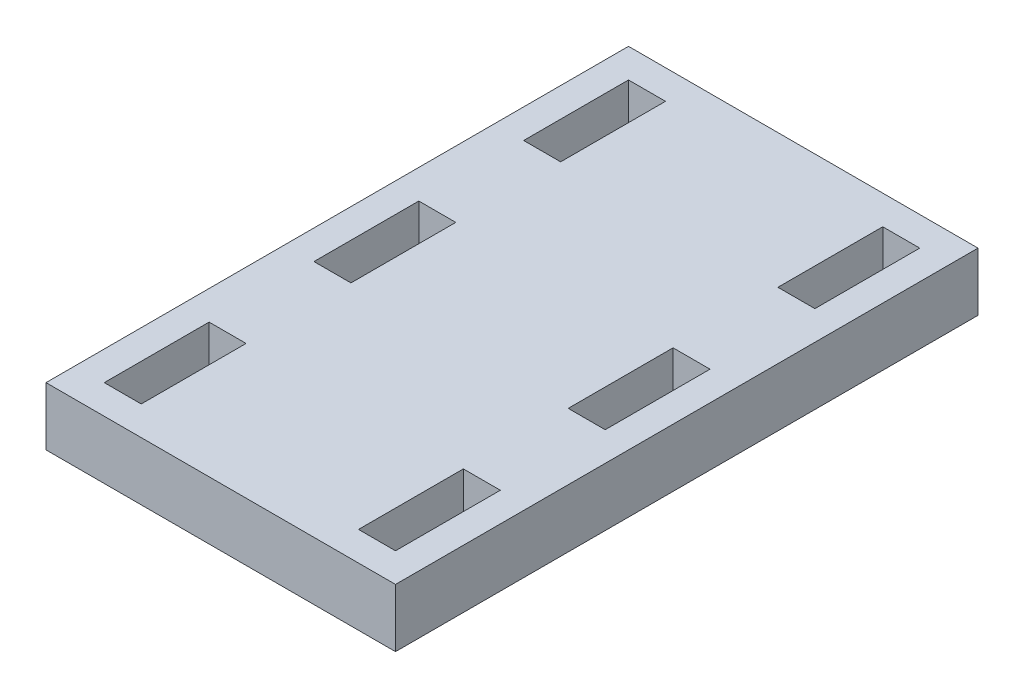
ISO-10303-21;
HEADER;
FILE_DESCRIPTION(('STEP AP214'),'2;1');
FILE_NAME('part.step','',(''),(''),'','','');
FILE_SCHEMA(('AUTOMOTIVE_DESIGN { 1 0 10303 214 1 1 1 1 }'));
ENDSEC;
DATA;
#1=APPLICATION_CONTEXT('core data for automotive mechanical design processes');
#2=APPLICATION_PROTOCOL_DEFINITION('international standard','automotive_design',2000,#1);
#3=PRODUCT_CONTEXT('',#1,'mechanical');
#4=PRODUCT('Part','Part','',(#3));
#5=PRODUCT_RELATED_PRODUCT_CATEGORY('part','',(#4));
#6=PRODUCT_DEFINITION_FORMATION('','',#4);
#7=PRODUCT_DEFINITION_CONTEXT('part definition',#1,'design');
#8=PRODUCT_DEFINITION('design','',#6,#7);
#9=PRODUCT_DEFINITION_SHAPE('','',#8);
#10=(LENGTH_UNIT() NAMED_UNIT(*) SI_UNIT(.MILLI.,.METRE.));
#11=(NAMED_UNIT(*) PLANE_ANGLE_UNIT() SI_UNIT($,.RADIAN.));
#12=(NAMED_UNIT(*) SI_UNIT($,.STERADIAN.) SOLID_ANGLE_UNIT());
#13=UNCERTAINTY_MEASURE_WITH_UNIT(LENGTH_MEASURE(1.E-05),#10,'distance_accuracy_value','');
#14=(GEOMETRIC_REPRESENTATION_CONTEXT(3) GLOBAL_UNCERTAINTY_ASSIGNED_CONTEXT((#13)) GLOBAL_UNIT_ASSIGNED_CONTEXT((#10,
#11,#12)) REPRESENTATION_CONTEXT('',''));
#15=CARTESIAN_POINT('',(0.,0.,0.));
#16=DIRECTION('',(0.,0.,1.));
#17=DIRECTION('',(1.,0.,0.));
#18=AXIS2_PLACEMENT_3D('',#15,#16,#17);
#19=CARTESIAN_POINT('',(0.,10.,0.));
#20=DIRECTION('',(0.,-1.,0.));
#21=DIRECTION('',(0.,0.,-1.));
#22=AXIS2_PLACEMENT_3D('',#19,#20,#21);
#23=PLANE('',#22);
#24=DIRECTION('',(0.,0.,-1.));
#25=VECTOR('',#24,1.);
#26=CARTESIAN_POINT('',(55.,10.,-41.));
#27=LINE('',#26,#25);
#28=CARTESIAN_POINT('',(55.,10.,-41.));
#29=VERTEX_POINT('',#28);
#30=CARTESIAN_POINT('',(55.,10.,-59.));
#31=VERTEX_POINT('',#30);
#32=EDGE_CURVE('E823',#29,#31,#27,.T.);
#33=ORIENTED_EDGE('',*,*,#32,.F.);
#34=DIRECTION('',(1.,0.,0.));
#35=VECTOR('',#34,1.);
#36=CARTESIAN_POINT('',(55.,10.,-41.));
#37=LINE('',#36,#35);
#38=CARTESIAN_POINT('',(48.65,10.,-41.));
#39=VERTEX_POINT('',#38);
#40=EDGE_CURVE('E838',#39,#29,#37,.T.);
#41=ORIENTED_EDGE('',*,*,#40,.F.);
#42=DIRECTION('',(0.,0.,1.));
#43=VECTOR('',#42,1.);
#44=CARTESIAN_POINT('',(48.65,10.,-41.));
#45=LINE('',#44,#43);
#46=CARTESIAN_POINT('',(48.65,10.,-59.));
#47=VERTEX_POINT('',#46);
#48=EDGE_CURVE('E886',#47,#39,#45,.T.);
#49=ORIENTED_EDGE('',*,*,#48,.F.);
#50=DIRECTION('',(-1.,0.,0.));
#51=VECTOR('',#50,1.);
#52=CARTESIAN_POINT('',(55.,10.,-59.));
#53=LINE('',#52,#51);
#54=EDGE_CURVE('E878',#31,#47,#53,.T.);
#55=ORIENTED_EDGE('',*,*,#54,.F.);
#56=EDGE_LOOP('',(#33,#41,#49,#55));
#57=FACE_BOUND('',#56,.T.);
#58=DIRECTION('',(0.,0.,1.));
#59=VECTOR('',#58,1.);
#60=CARTESIAN_POINT('',(5.,10.,-77.));
#61=LINE('',#60,#59);
#62=CARTESIAN_POINT('',(5.,10.,-95.));
#63=VERTEX_POINT('',#62);
#64=CARTESIAN_POINT('',(5.,10.,-77.));
#65=VERTEX_POINT('',#64);
#66=EDGE_CURVE('E479',#63,#65,#61,.T.);
#67=ORIENTED_EDGE('',*,*,#66,.F.);
#68=DIRECTION('',(-1.,0.,0.));
#69=VECTOR('',#68,1.);
#70=CARTESIAN_POINT('',(5.,10.,-95.));
#71=LINE('',#70,#69);
#72=CARTESIAN_POINT('',(11.35,10.,-95.));
#73=VERTEX_POINT('',#72);
#74=EDGE_CURVE('E492',#73,#63,#71,.T.);
#75=ORIENTED_EDGE('',*,*,#74,.F.);
#76=DIRECTION('',(0.,0.,-1.));
#77=VECTOR('',#76,1.);
#78=CARTESIAN_POINT('',(11.35,10.,-77.));
#79=LINE('',#78,#77);
#80=CARTESIAN_POINT('',(11.35,10.,-77.));
#81=VERTEX_POINT('',#80);
#82=EDGE_CURVE('E497',#81,#73,#79,.T.);
#83=ORIENTED_EDGE('',*,*,#82,.F.);
#84=DIRECTION('',(1.,0.,0.));
#85=VECTOR('',#84,1.);
#86=CARTESIAN_POINT('',(5.,10.,-77.));
#87=LINE('',#86,#85);
#88=EDGE_CURVE('E482',#65,#81,#87,.T.);
#89=ORIENTED_EDGE('',*,*,#88,.F.);
#90=EDGE_LOOP('',(#67,#75,#83,#89));
#91=FACE_BOUND('',#90,.T.);
#92=DIRECTION('',(0.,0.,1.));
#93=VECTOR('',#92,1.);
#94=CARTESIAN_POINT('',(5.,10.,-5.));
#95=LINE('',#94,#93);
#96=CARTESIAN_POINT('',(5.,10.,-23.));
#97=VERTEX_POINT('',#96);
#98=CARTESIAN_POINT('',(5.,10.,-5.));
#99=VERTEX_POINT('',#98);
#100=EDGE_CURVE('E339',#97,#99,#95,.T.);
#101=ORIENTED_EDGE('',*,*,#100,.F.);
#102=DIRECTION('',(-1.,0.,0.));
#103=VECTOR('',#102,1.);
#104=CARTESIAN_POINT('',(5.,10.,-23.));
#105=LINE('',#104,#103);
#106=CARTESIAN_POINT('',(11.35,10.,-23.));
#107=VERTEX_POINT('',#106);
#108=EDGE_CURVE('E355',#107,#97,#105,.T.);
#109=ORIENTED_EDGE('',*,*,#108,.F.);
#110=DIRECTION('',(0.,0.,-1.));
#111=VECTOR('',#110,1.);
#112=CARTESIAN_POINT('',(11.35,10.,-5.));
#113=LINE('',#112,#111);
#114=CARTESIAN_POINT('',(11.35,10.,-5.));
#115=VERTEX_POINT('',#114);
#116=EDGE_CURVE('E360',#115,#107,#113,.T.);
#117=ORIENTED_EDGE('',*,*,#116,.F.);
#118=DIRECTION('',(1.,0.,0.));
#119=VECTOR('',#118,1.);
#120=CARTESIAN_POINT('',(5.,10.,-5.));
#121=LINE('',#120,#119);
#122=EDGE_CURVE('E343',#99,#115,#121,.T.);
#123=ORIENTED_EDGE('',*,*,#122,.F.);
#124=EDGE_LOOP('',(#101,#109,#117,#123));
#125=FACE_BOUND('',#124,.T.);
#126=DIRECTION('',(0.,0.,1.));
#127=VECTOR('',#126,1.);
#128=CARTESIAN_POINT('',(0.,10.,0.));
#129=LINE('',#128,#127);
#130=CARTESIAN_POINT('',(0.,10.,-100.));
#131=VERTEX_POINT('',#130);
#132=CARTESIAN_POINT('',(0.,10.,0.));
#133=VERTEX_POINT('',#132);
#134=EDGE_CURVE('E390',#131,#133,#129,.T.);
#135=ORIENTED_EDGE('',*,*,#134,.T.);
#136=DIRECTION('',(1.,0.,0.));
#137=VECTOR('',#136,1.);
#138=CARTESIAN_POINT('',(0.,10.,0.));
#139=LINE('',#138,#137);
#140=CARTESIAN_POINT('',(60.,10.,0.));
#141=VERTEX_POINT('',#140);
#142=EDGE_CURVE('E395',#133,#141,#139,.T.);
#143=ORIENTED_EDGE('',*,*,#142,.T.);
#144=DIRECTION('',(0.,0.,-1.));
#145=VECTOR('',#144,1.);
#146=CARTESIAN_POINT('',(60.,10.,0.));
#147=LINE('',#146,#145);
#148=CARTESIAN_POINT('',(60.,10.,-100.));
#149=VERTEX_POINT('',#148);
#150=EDGE_CURVE('E405',#141,#149,#147,.T.);
#151=ORIENTED_EDGE('',*,*,#150,.T.);
#152=DIRECTION('',(-1.,0.,0.));
#153=VECTOR('',#152,1.);
#154=CARTESIAN_POINT('',(0.,10.,-100.));
#155=LINE('',#154,#153);
#156=EDGE_CURVE('E408',#149,#131,#155,.T.);
#157=ORIENTED_EDGE('',*,*,#156,.T.);
#158=EDGE_LOOP('',(#135,#143,#151,#157));
#159=FACE_BOUND('',#158,.T.);
#160=DIRECTION('',(0.,0.,1.));
#161=VECTOR('',#160,1.);
#162=CARTESIAN_POINT('',(5.,10.,-41.));
#163=LINE('',#162,#161);
#164=CARTESIAN_POINT('',(5.,10.,-59.));
#165=VERTEX_POINT('',#164);
#166=CARTESIAN_POINT('',(5.,10.,-41.));
#167=VERTEX_POINT('',#166);
#168=EDGE_CURVE('E229',#165,#167,#163,.T.);
#169=ORIENTED_EDGE('',*,*,#168,.F.);
#170=DIRECTION('',(-1.,0.,0.));
#171=VECTOR('',#170,1.);
#172=CARTESIAN_POINT('',(5.,10.,-59.));
#173=LINE('',#172,#171);
#174=CARTESIAN_POINT('',(11.35,10.,-59.));
#175=VERTEX_POINT('',#174);
#176=EDGE_CURVE('E259',#175,#165,#173,.T.);
#177=ORIENTED_EDGE('',*,*,#176,.F.);
#178=DIRECTION('',(0.,0.,-1.));
#179=VECTOR('',#178,1.);
#180=CARTESIAN_POINT('',(11.35,10.,-41.));
#181=LINE('',#180,#179);
#182=CARTESIAN_POINT('',(11.35,10.,-41.));
#183=VERTEX_POINT('',#182);
#184=EDGE_CURVE('E255',#183,#175,#181,.T.);
#185=ORIENTED_EDGE('',*,*,#184,.F.);
#186=DIRECTION('',(1.,0.,0.));
#187=VECTOR('',#186,1.);
#188=CARTESIAN_POINT('',(5.,10.,-41.));
#189=LINE('',#188,#187);
#190=EDGE_CURVE('E240',#167,#183,#189,.T.);
#191=ORIENTED_EDGE('',*,*,#190,.F.);
#192=EDGE_LOOP('',(#169,#177,#185,#191));
#193=FACE_BOUND('',#192,.T.);
#194=DIRECTION('',(1.,0.,0.));
#195=VECTOR('',#194,1.);
#196=CARTESIAN_POINT('',(55.,10.,-77.));
#197=LINE('',#196,#195);
#198=CARTESIAN_POINT('',(48.65,10.,-77.));
#199=VERTEX_POINT('',#198);
#200=CARTESIAN_POINT('',(55.,10.,-77.));
#201=VERTEX_POINT('',#200);
#202=EDGE_CURVE('E273',#199,#201,#197,.T.);
#203=ORIENTED_EDGE('',*,*,#202,.F.);
#204=DIRECTION('',(0.,0.,1.));
#205=VECTOR('',#204,1.);
#206=CARTESIAN_POINT('',(48.65,10.,-77.));
#207=LINE('',#206,#205);
#208=CARTESIAN_POINT('',(48.65,10.,-95.));
#209=VERTEX_POINT('',#208);
#210=EDGE_CURVE('E855',#209,#199,#207,.T.);
#211=ORIENTED_EDGE('',*,*,#210,.F.);
#212=DIRECTION('',(-1.,0.,0.));
#213=VECTOR('',#212,1.);
#214=CARTESIAN_POINT('',(55.,10.,-95.));
#215=LINE('',#214,#213);
#216=CARTESIAN_POINT('',(55.,10.,-95.));
#217=VERTEX_POINT('',#216);
#218=EDGE_CURVE('E285',#217,#209,#215,.T.);
#219=ORIENTED_EDGE('',*,*,#218,.F.);
#220=DIRECTION('',(0.,0.,-1.));
#221=VECTOR('',#220,1.);
#222=CARTESIAN_POINT('',(55.,10.,-77.));
#223=LINE('',#222,#221);
#224=EDGE_CURVE('E278',#201,#217,#223,.T.);
#225=ORIENTED_EDGE('',*,*,#224,.F.);
#226=EDGE_LOOP('',(#203,#211,#219,#225));
#227=FACE_BOUND('',#226,.T.);
#228=DIRECTION('',(0.,0.,-1.));
#229=VECTOR('',#228,1.);
#230=CARTESIAN_POINT('',(55.,10.,-5.));
#231=LINE('',#230,#229);
#232=CARTESIAN_POINT('',(55.,10.,-5.));
#233=VERTEX_POINT('',#232);
#234=CARTESIAN_POINT('',(55.,10.,-23.));
#235=VERTEX_POINT('',#234);
#236=EDGE_CURVE('E292',#233,#235,#231,.T.);
#237=ORIENTED_EDGE('',*,*,#236,.F.);
#238=DIRECTION('',(1.,0.,0.));
#239=VECTOR('',#238,1.);
#240=CARTESIAN_POINT('',(55.,10.,-5.));
#241=LINE('',#240,#239);
#242=CARTESIAN_POINT('',(48.65,10.,-5.));
#243=VERTEX_POINT('',#242);
#244=EDGE_CURVE('E306',#243,#233,#241,.T.);
#245=ORIENTED_EDGE('',*,*,#244,.F.);
#246=DIRECTION('',(0.,0.,1.));
#247=VECTOR('',#246,1.);
#248=CARTESIAN_POINT('',(48.65,10.,-5.));
#249=LINE('',#248,#247);
#250=CARTESIAN_POINT('',(48.65,10.,-23.));
#251=VERTEX_POINT('',#250);
#252=EDGE_CURVE('E303',#251,#243,#249,.T.);
#253=ORIENTED_EDGE('',*,*,#252,.F.);
#254=DIRECTION('',(-1.,0.,0.));
#255=VECTOR('',#254,1.);
#256=CARTESIAN_POINT('',(55.,10.,-23.));
#257=LINE('',#256,#255);
#258=EDGE_CURVE('E296',#235,#251,#257,.T.);
#259=ORIENTED_EDGE('',*,*,#258,.F.);
#260=EDGE_LOOP('',(#237,#245,#253,#259));
#261=FACE_BOUND('',#260,.T.);
#262=ADVANCED_FACE('F42',(#57,#91,#125,#159,#193,#227,#261),#23,.F.);
#263=CARTESIAN_POINT('',(0.,0.,0.));
#264=DIRECTION('',(0.,-1.,0.));
#265=DIRECTION('',(0.,0.,-1.));
#266=AXIS2_PLACEMENT_3D('',#263,#264,#265);
#267=PLANE('',#266);
#268=DIRECTION('',(0.,0.,1.));
#269=VECTOR('',#268,1.);
#270=CARTESIAN_POINT('',(0.,0.,0.));
#271=LINE('',#270,#269);
#272=CARTESIAN_POINT('',(0.,0.,-100.));
#273=VERTEX_POINT('',#272);
#274=CARTESIAN_POINT('',(0.,0.,0.));
#275=VERTEX_POINT('',#274);
#276=EDGE_CURVE('E389',#273,#275,#271,.T.);
#277=ORIENTED_EDGE('',*,*,#276,.F.);
#278=DIRECTION('',(-1.,0.,0.));
#279=VECTOR('',#278,1.);
#280=CARTESIAN_POINT('',(0.,0.,-100.));
#281=LINE('',#280,#279);
#282=CARTESIAN_POINT('',(60.,0.,-100.));
#283=VERTEX_POINT('',#282);
#284=EDGE_CURVE('E396',#283,#273,#281,.T.);
#285=ORIENTED_EDGE('',*,*,#284,.F.);
#286=DIRECTION('',(0.,0.,-1.));
#287=VECTOR('',#286,1.);
#288=CARTESIAN_POINT('',(60.,0.,0.));
#289=LINE('',#288,#287);
#290=CARTESIAN_POINT('',(60.,0.,0.));
#291=VERTEX_POINT('',#290);
#292=EDGE_CURVE('E419',#291,#283,#289,.T.);
#293=ORIENTED_EDGE('',*,*,#292,.F.);
#294=DIRECTION('',(1.,0.,0.));
#295=VECTOR('',#294,1.);
#296=CARTESIAN_POINT('',(0.,0.,0.));
#297=LINE('',#296,#295);
#298=EDGE_CURVE('E416',#275,#291,#297,.T.);
#299=ORIENTED_EDGE('',*,*,#298,.F.);
#300=EDGE_LOOP('',(#277,#285,#293,#299));
#301=FACE_BOUND('',#300,.T.);
#302=DIRECTION('',(-1.,0.,0.));
#303=VECTOR('',#302,1.);
#304=CARTESIAN_POINT('',(5.,0.,-23.));
#305=LINE('',#304,#303);
#306=CARTESIAN_POINT('',(11.35,0.,-23.));
#307=VERTEX_POINT('',#306);
#308=CARTESIAN_POINT('',(5.,0.,-23.));
#309=VERTEX_POINT('',#308);
#310=EDGE_CURVE('E344',#307,#309,#305,.T.);
#311=ORIENTED_EDGE('',*,*,#310,.T.);
#312=DIRECTION('',(0.,0.,1.));
#313=VECTOR('',#312,1.);
#314=CARTESIAN_POINT('',(5.,0.,-5.));
#315=LINE('',#314,#313);
#316=CARTESIAN_POINT('',(5.,0.,-5.));
#317=VERTEX_POINT('',#316);
#318=EDGE_CURVE('E249',#309,#317,#315,.T.);
#319=ORIENTED_EDGE('',*,*,#318,.T.);
#320=DIRECTION('',(1.,0.,0.));
#321=VECTOR('',#320,1.);
#322=CARTESIAN_POINT('',(5.,0.,-5.));
#323=LINE('',#322,#321);
#324=CARTESIAN_POINT('',(11.35,0.,-5.));
#325=VERTEX_POINT('',#324);
#326=EDGE_CURVE('E365',#317,#325,#323,.T.);
#327=ORIENTED_EDGE('',*,*,#326,.T.);
#328=DIRECTION('',(0.,0.,-1.));
#329=VECTOR('',#328,1.);
#330=CARTESIAN_POINT('',(11.35,0.,-5.));
#331=LINE('',#330,#329);
#332=EDGE_CURVE('E369',#325,#307,#331,.T.);
#333=ORIENTED_EDGE('',*,*,#332,.T.);
#334=EDGE_LOOP('',(#311,#319,#327,#333));
#335=FACE_BOUND('',#334,.T.);
#336=DIRECTION('',(-1.,0.,0.));
#337=VECTOR('',#336,1.);
#338=CARTESIAN_POINT('',(5.,0.,-59.));
#339=LINE('',#338,#337);
#340=CARTESIAN_POINT('',(11.35,0.,-59.));
#341=VERTEX_POINT('',#340);
#342=CARTESIAN_POINT('',(5.,0.,-59.));
#343=VERTEX_POINT('',#342);
#344=EDGE_CURVE('E241',#341,#343,#339,.T.);
#345=ORIENTED_EDGE('',*,*,#344,.T.);
#346=DIRECTION('',(0.,0.,1.));
#347=VECTOR('',#346,1.);
#348=CARTESIAN_POINT('',(5.,0.,-41.));
#349=LINE('',#348,#347);
#350=CARTESIAN_POINT('',(5.,0.,-41.));
#351=VERTEX_POINT('',#350);
#352=EDGE_CURVE('E467',#343,#351,#349,.T.);
#353=ORIENTED_EDGE('',*,*,#352,.T.);
#354=DIRECTION('',(1.,0.,0.));
#355=VECTOR('',#354,1.);
#356=CARTESIAN_POINT('',(5.,0.,-41.));
#357=LINE('',#356,#355);
#358=CARTESIAN_POINT('',(11.35,0.,-41.));
#359=VERTEX_POINT('',#358);
#360=EDGE_CURVE('E247',#351,#359,#357,.T.);
#361=ORIENTED_EDGE('',*,*,#360,.T.);
#362=DIRECTION('',(0.,0.,-1.));
#363=VECTOR('',#362,1.);
#364=CARTESIAN_POINT('',(11.35,0.,-41.));
#365=LINE('',#364,#363);
#366=EDGE_CURVE('E472',#359,#341,#365,.T.);
#367=ORIENTED_EDGE('',*,*,#366,.T.);
#368=EDGE_LOOP('',(#345,#353,#361,#367));
#369=FACE_BOUND('',#368,.T.);
#370=DIRECTION('',(-1.,0.,0.));
#371=VECTOR('',#370,1.);
#372=CARTESIAN_POINT('',(5.,0.,-95.));
#373=LINE('',#372,#371);
#374=CARTESIAN_POINT('',(11.35,0.,-95.));
#375=VERTEX_POINT('',#374);
#376=CARTESIAN_POINT('',(5.,0.,-95.));
#377=VERTEX_POINT('',#376);
#378=EDGE_CURVE('E483',#375,#377,#373,.T.);
#379=ORIENTED_EDGE('',*,*,#378,.T.);
#380=DIRECTION('',(0.,0.,1.));
#381=VECTOR('',#380,1.);
#382=CARTESIAN_POINT('',(5.,0.,-77.));
#383=LINE('',#382,#381);
#384=CARTESIAN_POINT('',(5.,0.,-77.));
#385=VERTEX_POINT('',#384);
#386=EDGE_CURVE('E499',#377,#385,#383,.T.);
#387=ORIENTED_EDGE('',*,*,#386,.T.);
#388=DIRECTION('',(1.,0.,0.));
#389=VECTOR('',#388,1.);
#390=CARTESIAN_POINT('',(5.,0.,-77.));
#391=LINE('',#390,#389);
#392=CARTESIAN_POINT('',(11.35,0.,-77.));
#393=VERTEX_POINT('',#392);
#394=EDGE_CURVE('E503',#385,#393,#391,.T.);
#395=ORIENTED_EDGE('',*,*,#394,.T.);
#396=DIRECTION('',(0.,0.,-1.));
#397=VECTOR('',#396,1.);
#398=CARTESIAN_POINT('',(11.35,0.,-77.));
#399=LINE('',#398,#397);
#400=EDGE_CURVE('E508',#393,#375,#399,.T.);
#401=ORIENTED_EDGE('',*,*,#400,.T.);
#402=EDGE_LOOP('',(#379,#387,#395,#401));
#403=FACE_BOUND('',#402,.T.);
#404=DIRECTION('',(0.,0.,1.));
#405=VECTOR('',#404,1.);
#406=CARTESIAN_POINT('',(48.65,0.,-77.));
#407=LINE('',#406,#405);
#408=CARTESIAN_POINT('',(48.65,0.,-95.));
#409=VERTEX_POINT('',#408);
#410=CARTESIAN_POINT('',(48.65,0.,-77.));
#411=VERTEX_POINT('',#410);
#412=EDGE_CURVE('E279',#409,#411,#407,.T.);
#413=ORIENTED_EDGE('',*,*,#412,.T.);
#414=DIRECTION('',(1.,0.,0.));
#415=VECTOR('',#414,1.);
#416=CARTESIAN_POINT('',(55.,0.,-77.));
#417=LINE('',#416,#415);
#418=CARTESIAN_POINT('',(55.,0.,-77.));
#419=VERTEX_POINT('',#418);
#420=EDGE_CURVE('E844',#411,#419,#417,.T.);
#421=ORIENTED_EDGE('',*,*,#420,.T.);
#422=DIRECTION('',(0.,0.,-1.));
#423=VECTOR('',#422,1.);
#424=CARTESIAN_POINT('',(55.,0.,-77.));
#425=LINE('',#424,#423);
#426=CARTESIAN_POINT('',(55.,0.,-95.));
#427=VERTEX_POINT('',#426);
#428=EDGE_CURVE('E848',#419,#427,#425,.T.);
#429=ORIENTED_EDGE('',*,*,#428,.T.);
#430=DIRECTION('',(-1.,0.,0.));
#431=VECTOR('',#430,1.);
#432=CARTESIAN_POINT('',(55.,0.,-95.));
#433=LINE('',#432,#431);
#434=EDGE_CURVE('E853',#427,#409,#433,.T.);
#435=ORIENTED_EDGE('',*,*,#434,.T.);
#436=EDGE_LOOP('',(#413,#421,#429,#435));
#437=FACE_BOUND('',#436,.T.);
#438=DIRECTION('',(1.,0.,0.));
#439=VECTOR('',#438,1.);
#440=CARTESIAN_POINT('',(55.,0.,-41.));
#441=LINE('',#440,#439);
#442=CARTESIAN_POINT('',(48.65,0.,-41.));
#443=VERTEX_POINT('',#442);
#444=CARTESIAN_POINT('',(55.,0.,-41.));
#445=VERTEX_POINT('',#444);
#446=EDGE_CURVE('E816',#443,#445,#441,.T.);
#447=ORIENTED_EDGE('',*,*,#446,.T.);
#448=DIRECTION('',(0.,0.,-1.));
#449=VECTOR('',#448,1.);
#450=CARTESIAN_POINT('',(55.,0.,-41.));
#451=LINE('',#450,#449);
#452=CARTESIAN_POINT('',(55.,0.,-59.));
#453=VERTEX_POINT('',#452);
#454=EDGE_CURVE('E338',#445,#453,#451,.T.);
#455=ORIENTED_EDGE('',*,*,#454,.T.);
#456=DIRECTION('',(-1.,0.,0.));
#457=VECTOR('',#456,1.);
#458=CARTESIAN_POINT('',(55.,0.,-59.));
#459=LINE('',#458,#457);
#460=CARTESIAN_POINT('',(48.65,0.,-59.));
#461=VERTEX_POINT('',#460);
#462=EDGE_CURVE('E828',#453,#461,#459,.T.);
#463=ORIENTED_EDGE('',*,*,#462,.T.);
#464=DIRECTION('',(0.,0.,1.));
#465=VECTOR('',#464,1.);
#466=CARTESIAN_POINT('',(48.65,0.,-41.));
#467=LINE('',#466,#465);
#468=EDGE_CURVE('E824',#461,#443,#467,.T.);
#469=ORIENTED_EDGE('',*,*,#468,.T.);
#470=EDGE_LOOP('',(#447,#455,#463,#469));
#471=FACE_BOUND('',#470,.T.);
#472=DIRECTION('',(1.,0.,0.));
#473=VECTOR('',#472,1.);
#474=CARTESIAN_POINT('',(55.,0.,-5.));
#475=LINE('',#474,#473);
#476=CARTESIAN_POINT('',(48.65,0.,-5.));
#477=VERTEX_POINT('',#476);
#478=CARTESIAN_POINT('',(55.,0.,-5.));
#479=VERTEX_POINT('',#478);
#480=EDGE_CURVE('E297',#477,#479,#475,.T.);
#481=ORIENTED_EDGE('',*,*,#480,.T.);
#482=DIRECTION('',(0.,0.,-1.));
#483=VECTOR('',#482,1.);
#484=CARTESIAN_POINT('',(55.,0.,-5.));
#485=LINE('',#484,#483);
#486=CARTESIAN_POINT('',(55.,0.,-23.));
#487=VERTEX_POINT('',#486);
#488=EDGE_CURVE('E311',#479,#487,#485,.T.);
#489=ORIENTED_EDGE('',*,*,#488,.T.);
#490=DIRECTION('',(-1.,0.,0.));
#491=VECTOR('',#490,1.);
#492=CARTESIAN_POINT('',(55.,0.,-23.));
#493=LINE('',#492,#491);
#494=CARTESIAN_POINT('',(48.65,0.,-23.));
#495=VERTEX_POINT('',#494);
#496=EDGE_CURVE('E315',#487,#495,#493,.T.);
#497=ORIENTED_EDGE('',*,*,#496,.T.);
#498=DIRECTION('',(0.,0.,1.));
#499=VECTOR('',#498,1.);
#500=CARTESIAN_POINT('',(48.65,0.,-5.));
#501=LINE('',#500,#499);
#502=EDGE_CURVE('E319',#495,#477,#501,.T.);
#503=ORIENTED_EDGE('',*,*,#502,.T.);
#504=EDGE_LOOP('',(#481,#489,#497,#503));
#505=FACE_BOUND('',#504,.T.);
#506=ADVANCED_FACE('F442',(#301,#335,#369,#403,#437,#471,#505),#267,.T.);
#507=CARTESIAN_POINT('',(0.,10.,0.));
#508=DIRECTION('',(1.,0.,0.));
#509=DIRECTION('',(0.,0.,-1.));
#510=AXIS2_PLACEMENT_3D('',#507,#508,#509);
#511=PLANE('',#510);
#512=ORIENTED_EDGE('',*,*,#276,.T.);
#513=DIRECTION('',(0.,-1.,0.));
#514=VECTOR('',#513,1.);
#515=CARTESIAN_POINT('',(0.,10.,0.));
#516=LINE('',#515,#514);
#517=EDGE_CURVE('E12',#133,#275,#516,.T.);
#518=ORIENTED_EDGE('',*,*,#517,.F.);
#519=ORIENTED_EDGE('',*,*,#134,.F.);
#520=DIRECTION('',(0.,-1.,0.));
#521=VECTOR('',#520,1.);
#522=CARTESIAN_POINT('',(0.,10.,-100.));
#523=LINE('',#522,#521);
#524=EDGE_CURVE('E412',#131,#273,#523,.T.);
#525=ORIENTED_EDGE('',*,*,#524,.T.);
#526=EDGE_LOOP('',(#512,#518,#519,#525));
#527=FACE_BOUND('',#526,.T.);
#528=ADVANCED_FACE('F44',(#527),#511,.F.);
#529=CARTESIAN_POINT('',(0.,10.,0.));
#530=DIRECTION('',(0.,0.,-1.));
#531=DIRECTION('',(-1.,0.,0.));
#532=AXIS2_PLACEMENT_3D('',#529,#530,#531);
#533=PLANE('',#532);
#534=ORIENTED_EDGE('',*,*,#298,.T.);
#535=DIRECTION('',(0.,-1.,0.));
#536=VECTOR('',#535,1.);
#537=CARTESIAN_POINT('',(60.,10.,0.));
#538=LINE('',#537,#536);
#539=EDGE_CURVE('E51',#141,#291,#538,.T.);
#540=ORIENTED_EDGE('',*,*,#539,.F.);
#541=ORIENTED_EDGE('',*,*,#142,.F.);
#542=ORIENTED_EDGE('',*,*,#517,.T.);
#543=EDGE_LOOP('',(#534,#540,#541,#542));
#544=FACE_BOUND('',#543,.T.);
#545=ADVANCED_FACE('F572',(#544),#533,.F.);
#546=CARTESIAN_POINT('',(60.,10.,0.));
#547=DIRECTION('',(-1.,0.,0.));
#548=DIRECTION('',(0.,0.,1.));
#549=AXIS2_PLACEMENT_3D('',#546,#547,#548);
#550=PLANE('',#549);
#551=ORIENTED_EDGE('',*,*,#292,.T.);
#552=DIRECTION('',(0.,-1.,0.));
#553=VECTOR('',#552,1.);
#554=CARTESIAN_POINT('',(60.,10.,-100.));
#555=LINE('',#554,#553);
#556=EDGE_CURVE('E427',#149,#283,#555,.T.);
#557=ORIENTED_EDGE('',*,*,#556,.F.);
#558=ORIENTED_EDGE('',*,*,#150,.F.);
#559=ORIENTED_EDGE('',*,*,#539,.T.);
#560=EDGE_LOOP('',(#551,#557,#558,#559));
#561=FACE_BOUND('',#560,.T.);
#562=ADVANCED_FACE('F436',(#561),#550,.F.);
#563=CARTESIAN_POINT('',(0.,10.,-100.));
#564=DIRECTION('',(0.,0.,1.));
#565=DIRECTION('',(1.,0.,0.));
#566=AXIS2_PLACEMENT_3D('',#563,#564,#565);
#567=PLANE('',#566);
#568=ORIENTED_EDGE('',*,*,#284,.T.);
#569=ORIENTED_EDGE('',*,*,#524,.F.);
#570=ORIENTED_EDGE('',*,*,#156,.F.);
#571=ORIENTED_EDGE('',*,*,#556,.T.);
#572=EDGE_LOOP('',(#568,#569,#570,#571));
#573=FACE_BOUND('',#572,.T.);
#574=ADVANCED_FACE('F446',(#573),#567,.F.);
#575=CARTESIAN_POINT('',(5.,10.,-5.));
#576=DIRECTION('',(1.,0.,0.));
#577=DIRECTION('',(0.,0.,-1.));
#578=AXIS2_PLACEMENT_3D('',#575,#576,#577);
#579=PLANE('',#578);
#580=ORIENTED_EDGE('',*,*,#318,.F.);
#581=DIRECTION('',(0.,-1.,0.));
#582=VECTOR('',#581,1.);
#583=CARTESIAN_POINT('',(5.,10.,-23.));
#584=LINE('',#583,#582);
#585=EDGE_CURVE('E359',#97,#309,#584,.T.);
#586=ORIENTED_EDGE('',*,*,#585,.F.);
#587=ORIENTED_EDGE('',*,*,#100,.T.);
#588=DIRECTION('',(0.,-1.,0.));
#589=VECTOR('',#588,1.);
#590=CARTESIAN_POINT('',(5.,10.,-5.));
#591=LINE('',#590,#589);
#592=EDGE_CURVE('E385',#99,#317,#591,.T.);
#593=ORIENTED_EDGE('',*,*,#592,.T.);
#594=EDGE_LOOP('',(#580,#586,#587,#593));
#595=FACE_BOUND('',#594,.T.);
#596=ADVANCED_FACE('F566',(#595),#579,.T.);
#597=CARTESIAN_POINT('',(5.,10.,-5.));
#598=DIRECTION('',(0.,0.,-1.));
#599=DIRECTION('',(-1.,0.,0.));
#600=AXIS2_PLACEMENT_3D('',#597,#598,#599);
#601=PLANE('',#600);
#602=ORIENTED_EDGE('',*,*,#326,.F.);
#603=ORIENTED_EDGE('',*,*,#592,.F.);
#604=ORIENTED_EDGE('',*,*,#122,.T.);
#605=DIRECTION('',(0.,-1.,0.));
#606=VECTOR('',#605,1.);
#607=CARTESIAN_POINT('',(11.35,10.,-5.));
#608=LINE('',#607,#606);
#609=EDGE_CURVE('E382',#115,#325,#608,.T.);
#610=ORIENTED_EDGE('',*,*,#609,.T.);
#611=EDGE_LOOP('',(#602,#603,#604,#610));
#612=FACE_BOUND('',#611,.T.);
#613=ADVANCED_FACE('F596',(#612),#601,.T.);
#614=CARTESIAN_POINT('',(11.35,10.,-5.));
#615=DIRECTION('',(-1.,0.,0.));
#616=DIRECTION('',(0.,0.,1.));
#617=AXIS2_PLACEMENT_3D('',#614,#615,#616);
#618=PLANE('',#617);
#619=ORIENTED_EDGE('',*,*,#332,.F.);
#620=ORIENTED_EDGE('',*,*,#609,.F.);
#621=ORIENTED_EDGE('',*,*,#116,.T.);
#622=DIRECTION('',(0.,-1.,0.));
#623=VECTOR('',#622,1.);
#624=CARTESIAN_POINT('',(11.35,10.,-23.));
#625=LINE('',#624,#623);
#626=EDGE_CURVE('E379',#107,#307,#625,.T.);
#627=ORIENTED_EDGE('',*,*,#626,.T.);
#628=EDGE_LOOP('',(#619,#620,#621,#627));
#629=FACE_BOUND('',#628,.T.);
#630=ADVANCED_FACE('F605',(#629),#618,.T.);
#631=CARTESIAN_POINT('',(5.,10.,-23.));
#632=DIRECTION('',(0.,0.,1.));
#633=DIRECTION('',(1.,0.,0.));
#634=AXIS2_PLACEMENT_3D('',#631,#632,#633);
#635=PLANE('',#634);
#636=ORIENTED_EDGE('',*,*,#310,.F.);
#637=ORIENTED_EDGE('',*,*,#626,.F.);
#638=ORIENTED_EDGE('',*,*,#108,.T.);
#639=ORIENTED_EDGE('',*,*,#585,.T.);
#640=EDGE_LOOP('',(#636,#637,#638,#639));
#641=FACE_BOUND('',#640,.T.);
#642=ADVANCED_FACE('F614',(#641),#635,.T.);
#643=CARTESIAN_POINT('',(5.,10.,-41.));
#644=DIRECTION('',(1.,0.,0.));
#645=DIRECTION('',(0.,0.,-1.));
#646=AXIS2_PLACEMENT_3D('',#643,#644,#645);
#647=PLANE('',#646);
#648=ORIENTED_EDGE('',*,*,#352,.F.);
#649=DIRECTION('',(0.,-1.,0.));
#650=VECTOR('',#649,1.);
#651=CARTESIAN_POINT('',(5.,10.,-59.));
#652=LINE('',#651,#650);
#653=EDGE_CURVE('E235',#165,#343,#652,.T.);
#654=ORIENTED_EDGE('',*,*,#653,.F.);
#655=ORIENTED_EDGE('',*,*,#168,.T.);
#656=DIRECTION('',(0.,-1.,0.));
#657=VECTOR('',#656,1.);
#658=CARTESIAN_POINT('',(5.,10.,-41.));
#659=LINE('',#658,#657);
#660=EDGE_CURVE('E232',#167,#351,#659,.T.);
#661=ORIENTED_EDGE('',*,*,#660,.T.);
#662=EDGE_LOOP('',(#648,#654,#655,#661));
#663=FACE_BOUND('',#662,.T.);
#664=ADVANCED_FACE('F231',(#663),#647,.T.);
#665=CARTESIAN_POINT('',(5.,10.,-41.));
#666=DIRECTION('',(0.,0.,-1.));
#667=DIRECTION('',(-1.,0.,0.));
#668=AXIS2_PLACEMENT_3D('',#665,#666,#667);
#669=PLANE('',#668);
#670=ORIENTED_EDGE('',*,*,#360,.F.);
#671=ORIENTED_EDGE('',*,*,#660,.F.);
#672=ORIENTED_EDGE('',*,*,#190,.T.);
#673=DIRECTION('',(0.,-1.,0.));
#674=VECTOR('',#673,1.);
#675=CARTESIAN_POINT('',(11.35,10.,-41.));
#676=LINE('',#675,#674);
#677=EDGE_CURVE('E250',#183,#359,#676,.T.);
#678=ORIENTED_EDGE('',*,*,#677,.T.);
#679=EDGE_LOOP('',(#670,#671,#672,#678));
#680=FACE_BOUND('',#679,.T.);
#681=ADVANCED_FACE('F244',(#680),#669,.T.);
#682=CARTESIAN_POINT('',(11.35,10.,-41.));
#683=DIRECTION('',(-1.,0.,0.));
#684=DIRECTION('',(0.,0.,1.));
#685=AXIS2_PLACEMENT_3D('',#682,#683,#684);
#686=PLANE('',#685);
#687=ORIENTED_EDGE('',*,*,#366,.F.);
#688=ORIENTED_EDGE('',*,*,#677,.F.);
#689=ORIENTED_EDGE('',*,*,#184,.T.);
#690=DIRECTION('',(0.,-1.,0.));
#691=VECTOR('',#690,1.);
#692=CARTESIAN_POINT('',(11.35,10.,-59.));
#693=LINE('',#692,#691);
#694=EDGE_CURVE('E458',#175,#341,#693,.T.);
#695=ORIENTED_EDGE('',*,*,#694,.T.);
#696=EDGE_LOOP('',(#687,#688,#689,#695));
#697=FACE_BOUND('',#696,.T.);
#698=ADVANCED_FACE('F641',(#697),#686,.T.);
#699=CARTESIAN_POINT('',(5.,10.,-59.));
#700=DIRECTION('',(0.,0.,1.));
#701=DIRECTION('',(1.,0.,0.));
#702=AXIS2_PLACEMENT_3D('',#699,#700,#701);
#703=PLANE('',#702);
#704=ORIENTED_EDGE('',*,*,#344,.F.);
#705=ORIENTED_EDGE('',*,*,#694,.F.);
#706=ORIENTED_EDGE('',*,*,#176,.T.);
#707=ORIENTED_EDGE('',*,*,#653,.T.);
#708=EDGE_LOOP('',(#704,#705,#706,#707));
#709=FACE_BOUND('',#708,.T.);
#710=ADVANCED_FACE('F650',(#709),#703,.T.);
#711=CARTESIAN_POINT('',(5.,10.,-77.));
#712=DIRECTION('',(1.,0.,0.));
#713=DIRECTION('',(0.,0.,-1.));
#714=AXIS2_PLACEMENT_3D('',#711,#712,#713);
#715=PLANE('',#714);
#716=ORIENTED_EDGE('',*,*,#386,.F.);
#717=DIRECTION('',(0.,-1.,0.));
#718=VECTOR('',#717,1.);
#719=CARTESIAN_POINT('',(5.,10.,-95.));
#720=LINE('',#719,#718);
#721=EDGE_CURVE('E496',#63,#377,#720,.T.);
#722=ORIENTED_EDGE('',*,*,#721,.F.);
#723=ORIENTED_EDGE('',*,*,#66,.T.);
#724=DIRECTION('',(0.,-1.,0.));
#725=VECTOR('',#724,1.);
#726=CARTESIAN_POINT('',(5.,10.,-77.));
#727=LINE('',#726,#725);
#728=EDGE_CURVE('E280',#65,#385,#727,.T.);
#729=ORIENTED_EDGE('',*,*,#728,.T.);
#730=EDGE_LOOP('',(#716,#722,#723,#729));
#731=FACE_BOUND('',#730,.T.);
#732=ADVANCED_FACE('F529',(#731),#715,.T.);
#733=CARTESIAN_POINT('',(5.,10.,-77.));
#734=DIRECTION('',(0.,0.,-1.));
#735=DIRECTION('',(-1.,0.,0.));
#736=AXIS2_PLACEMENT_3D('',#733,#734,#735);
#737=PLANE('',#736);
#738=ORIENTED_EDGE('',*,*,#394,.F.);
#739=ORIENTED_EDGE('',*,*,#728,.F.);
#740=ORIENTED_EDGE('',*,*,#88,.T.);
#741=DIRECTION('',(0.,-1.,0.));
#742=VECTOR('',#741,1.);
#743=CARTESIAN_POINT('',(11.35,10.,-77.));
#744=LINE('',#743,#742);
#745=EDGE_CURVE('E520',#81,#393,#744,.T.);
#746=ORIENTED_EDGE('',*,*,#745,.T.);
#747=EDGE_LOOP('',(#738,#739,#740,#746));
#748=FACE_BOUND('',#747,.T.);
#749=ADVANCED_FACE('F548',(#748),#737,.T.);
#750=CARTESIAN_POINT('',(11.35,10.,-77.));
#751=DIRECTION('',(-1.,0.,0.));
#752=DIRECTION('',(0.,0.,1.));
#753=AXIS2_PLACEMENT_3D('',#750,#751,#752);
#754=PLANE('',#753);
#755=ORIENTED_EDGE('',*,*,#400,.F.);
#756=ORIENTED_EDGE('',*,*,#745,.F.);
#757=ORIENTED_EDGE('',*,*,#82,.T.);
#758=DIRECTION('',(0.,-1.,0.));
#759=VECTOR('',#758,1.);
#760=CARTESIAN_POINT('',(11.35,10.,-95.));
#761=LINE('',#760,#759);
#762=EDGE_CURVE('E518',#73,#375,#761,.T.);
#763=ORIENTED_EDGE('',*,*,#762,.T.);
#764=EDGE_LOOP('',(#755,#756,#757,#763));
#765=FACE_BOUND('',#764,.T.);
#766=ADVANCED_FACE('F546',(#765),#754,.T.);
#767=CARTESIAN_POINT('',(5.,10.,-95.));
#768=DIRECTION('',(0.,0.,1.));
#769=DIRECTION('',(1.,0.,0.));
#770=AXIS2_PLACEMENT_3D('',#767,#768,#769);
#771=PLANE('',#770);
#772=ORIENTED_EDGE('',*,*,#378,.F.);
#773=ORIENTED_EDGE('',*,*,#762,.F.);
#774=ORIENTED_EDGE('',*,*,#74,.T.);
#775=ORIENTED_EDGE('',*,*,#721,.T.);
#776=EDGE_LOOP('',(#772,#773,#774,#775));
#777=FACE_BOUND('',#776,.T.);
#778=ADVANCED_FACE('F537',(#777),#771,.T.);
#779=CARTESIAN_POINT('',(55.,10.,-77.));
#780=DIRECTION('',(0.,0.,-1.));
#781=DIRECTION('',(-1.,0.,0.));
#782=AXIS2_PLACEMENT_3D('',#779,#780,#781);
#783=PLANE('',#782);
#784=ORIENTED_EDGE('',*,*,#420,.F.);
#785=DIRECTION('',(0.,-1.,0.));
#786=VECTOR('',#785,1.);
#787=CARTESIAN_POINT('',(48.65,10.,-77.));
#788=LINE('',#787,#786);
#789=EDGE_CURVE('E863',#199,#411,#788,.T.);
#790=ORIENTED_EDGE('',*,*,#789,.F.);
#791=ORIENTED_EDGE('',*,*,#202,.T.);
#792=DIRECTION('',(0.,-1.,0.));
#793=VECTOR('',#792,1.);
#794=CARTESIAN_POINT('',(55.,10.,-77.));
#795=LINE('',#794,#793);
#796=EDGE_CURVE('E504',#201,#419,#795,.T.);
#797=ORIENTED_EDGE('',*,*,#796,.T.);
#798=EDGE_LOOP('',(#784,#790,#791,#797));
#799=FACE_BOUND('',#798,.T.);
#800=ADVANCED_FACE('F554',(#799),#783,.T.);
#801=CARTESIAN_POINT('',(55.,10.,-77.));
#802=DIRECTION('',(-1.,0.,0.));
#803=DIRECTION('',(0.,0.,1.));
#804=AXIS2_PLACEMENT_3D('',#801,#802,#803);
#805=PLANE('',#804);
#806=ORIENTED_EDGE('',*,*,#428,.F.);
#807=ORIENTED_EDGE('',*,*,#796,.F.);
#808=ORIENTED_EDGE('',*,*,#224,.T.);
#809=DIRECTION('',(0.,-1.,0.));
#810=VECTOR('',#809,1.);
#811=CARTESIAN_POINT('',(55.,10.,-95.));
#812=LINE('',#811,#810);
#813=EDGE_CURVE('E870',#217,#427,#812,.T.);
#814=ORIENTED_EDGE('',*,*,#813,.T.);
#815=EDGE_LOOP('',(#806,#807,#808,#814));
#816=FACE_BOUND('',#815,.T.);
#817=ADVANCED_FACE('F692',(#816),#805,.T.);
#818=CARTESIAN_POINT('',(55.,10.,-95.));
#819=DIRECTION('',(0.,0.,1.));
#820=DIRECTION('',(1.,0.,0.));
#821=AXIS2_PLACEMENT_3D('',#818,#819,#820);
#822=PLANE('',#821);
#823=ORIENTED_EDGE('',*,*,#434,.F.);
#824=ORIENTED_EDGE('',*,*,#813,.F.);
#825=ORIENTED_EDGE('',*,*,#218,.T.);
#826=DIRECTION('',(0.,-1.,0.));
#827=VECTOR('',#826,1.);
#828=CARTESIAN_POINT('',(48.65,10.,-95.));
#829=LINE('',#828,#827);
#830=EDGE_CURVE('E867',#209,#409,#829,.T.);
#831=ORIENTED_EDGE('',*,*,#830,.T.);
#832=EDGE_LOOP('',(#823,#824,#825,#831));
#833=FACE_BOUND('',#832,.T.);
#834=ADVANCED_FACE('F702',(#833),#822,.T.);
#835=CARTESIAN_POINT('',(48.65,10.,-77.));
#836=DIRECTION('',(1.,0.,0.));
#837=DIRECTION('',(0.,0.,-1.));
#838=AXIS2_PLACEMENT_3D('',#835,#836,#837);
#839=PLANE('',#838);
#840=ORIENTED_EDGE('',*,*,#412,.F.);
#841=ORIENTED_EDGE('',*,*,#830,.F.);
#842=ORIENTED_EDGE('',*,*,#210,.T.);
#843=ORIENTED_EDGE('',*,*,#789,.T.);
#844=EDGE_LOOP('',(#840,#841,#842,#843));
#845=FACE_BOUND('',#844,.T.);
#846=ADVANCED_FACE('F712',(#845),#839,.T.);
#847=CARTESIAN_POINT('',(55.,10.,-41.));
#848=DIRECTION('',(-1.,0.,0.));
#849=DIRECTION('',(0.,0.,1.));
#850=AXIS2_PLACEMENT_3D('',#847,#848,#849);
#851=PLANE('',#850);
#852=ORIENTED_EDGE('',*,*,#454,.F.);
#853=DIRECTION('',(0.,-1.,0.));
#854=VECTOR('',#853,1.);
#855=CARTESIAN_POINT('',(55.,10.,-41.));
#856=LINE('',#855,#854);
#857=EDGE_CURVE('E819',#29,#445,#856,.T.);
#858=ORIENTED_EDGE('',*,*,#857,.F.);
#859=ORIENTED_EDGE('',*,*,#32,.T.);
#860=DIRECTION('',(0.,-1.,0.));
#861=VECTOR('',#860,1.);
#862=CARTESIAN_POINT('',(55.,10.,-59.));
#863=LINE('',#862,#861);
#864=EDGE_CURVE('E298',#31,#453,#863,.T.);
#865=ORIENTED_EDGE('',*,*,#864,.T.);
#866=EDGE_LOOP('',(#852,#858,#859,#865));
#867=FACE_BOUND('',#866,.T.);
#868=ADVANCED_FACE('F722',(#867),#851,.T.);
#869=CARTESIAN_POINT('',(55.,10.,-59.));
#870=DIRECTION('',(0.,0.,1.));
#871=DIRECTION('',(1.,0.,0.));
#872=AXIS2_PLACEMENT_3D('',#869,#870,#871);
#873=PLANE('',#872);
#874=ORIENTED_EDGE('',*,*,#462,.F.);
#875=ORIENTED_EDGE('',*,*,#864,.F.);
#876=ORIENTED_EDGE('',*,*,#54,.T.);
#877=DIRECTION('',(0.,-1.,0.));
#878=VECTOR('',#877,1.);
#879=CARTESIAN_POINT('',(48.65,10.,-59.));
#880=LINE('',#879,#878);
#881=EDGE_CURVE('E840',#47,#461,#880,.T.);
#882=ORIENTED_EDGE('',*,*,#881,.T.);
#883=EDGE_LOOP('',(#874,#875,#876,#882));
#884=FACE_BOUND('',#883,.T.);
#885=ADVANCED_FACE('F732',(#884),#873,.T.);
#886=CARTESIAN_POINT('',(48.65,10.,-41.));
#887=DIRECTION('',(1.,0.,0.));
#888=DIRECTION('',(0.,0.,-1.));
#889=AXIS2_PLACEMENT_3D('',#886,#887,#888);
#890=PLANE('',#889);
#891=ORIENTED_EDGE('',*,*,#468,.F.);
#892=ORIENTED_EDGE('',*,*,#881,.F.);
#893=ORIENTED_EDGE('',*,*,#48,.T.);
#894=DIRECTION('',(0.,-1.,0.));
#895=VECTOR('',#894,1.);
#896=CARTESIAN_POINT('',(48.65,10.,-41.));
#897=LINE('',#896,#895);
#898=EDGE_CURVE('E66',#39,#443,#897,.T.);
#899=ORIENTED_EDGE('',*,*,#898,.T.);
#900=EDGE_LOOP('',(#891,#892,#893,#899));
#901=FACE_BOUND('',#900,.T.);
#902=ADVANCED_FACE('F742',(#901),#890,.T.);
#903=CARTESIAN_POINT('',(55.,10.,-41.));
#904=DIRECTION('',(0.,0.,-1.));
#905=DIRECTION('',(-1.,0.,0.));
#906=AXIS2_PLACEMENT_3D('',#903,#904,#905);
#907=PLANE('',#906);
#908=ORIENTED_EDGE('',*,*,#446,.F.);
#909=ORIENTED_EDGE('',*,*,#898,.F.);
#910=ORIENTED_EDGE('',*,*,#40,.T.);
#911=ORIENTED_EDGE('',*,*,#857,.T.);
#912=EDGE_LOOP('',(#908,#909,#910,#911));
#913=FACE_BOUND('',#912,.T.);
#914=ADVANCED_FACE('F752',(#913),#907,.T.);
#915=CARTESIAN_POINT('',(55.,10.,-5.));
#916=DIRECTION('',(-1.,0.,0.));
#917=DIRECTION('',(0.,0.,1.));
#918=AXIS2_PLACEMENT_3D('',#915,#916,#917);
#919=PLANE('',#918);
#920=ORIENTED_EDGE('',*,*,#488,.F.);
#921=DIRECTION('',(0.,-1.,0.));
#922=VECTOR('',#921,1.);
#923=CARTESIAN_POINT('',(55.,10.,-5.));
#924=LINE('',#923,#922);
#925=EDGE_CURVE('E310',#233,#479,#924,.T.);
#926=ORIENTED_EDGE('',*,*,#925,.F.);
#927=ORIENTED_EDGE('',*,*,#236,.T.);
#928=DIRECTION('',(0.,-1.,0.));
#929=VECTOR('',#928,1.);
#930=CARTESIAN_POINT('',(55.,10.,-23.));
#931=LINE('',#930,#929);
#932=EDGE_CURVE('E334',#235,#487,#931,.T.);
#933=ORIENTED_EDGE('',*,*,#932,.T.);
#934=EDGE_LOOP('',(#920,#926,#927,#933));
#935=FACE_BOUND('',#934,.T.);
#936=ADVANCED_FACE('F762',(#935),#919,.T.);
#937=CARTESIAN_POINT('',(55.,10.,-23.));
#938=DIRECTION('',(0.,0.,1.));
#939=DIRECTION('',(1.,0.,0.));
#940=AXIS2_PLACEMENT_3D('',#937,#938,#939);
#941=PLANE('',#940);
#942=ORIENTED_EDGE('',*,*,#496,.F.);
#943=ORIENTED_EDGE('',*,*,#932,.F.);
#944=ORIENTED_EDGE('',*,*,#258,.T.);
#945=DIRECTION('',(0.,-1.,0.));
#946=VECTOR('',#945,1.);
#947=CARTESIAN_POINT('',(48.65,10.,-23.));
#948=LINE('',#947,#946);
#949=EDGE_CURVE('E331',#251,#495,#948,.T.);
#950=ORIENTED_EDGE('',*,*,#949,.T.);
#951=EDGE_LOOP('',(#942,#943,#944,#950));
#952=FACE_BOUND('',#951,.T.);
#953=ADVANCED_FACE('F771',(#952),#941,.T.);
#954=CARTESIAN_POINT('',(48.65,10.,-5.));
#955=DIRECTION('',(1.,0.,0.));
#956=DIRECTION('',(0.,0.,-1.));
#957=AXIS2_PLACEMENT_3D('',#954,#955,#956);
#958=PLANE('',#957);
#959=ORIENTED_EDGE('',*,*,#502,.F.);
#960=ORIENTED_EDGE('',*,*,#949,.F.);
#961=ORIENTED_EDGE('',*,*,#252,.T.);
#962=DIRECTION('',(0.,-1.,0.));
#963=VECTOR('',#962,1.);
#964=CARTESIAN_POINT('',(48.65,10.,-5.));
#965=LINE('',#964,#963);
#966=EDGE_CURVE('E58',#243,#477,#965,.T.);
#967=ORIENTED_EDGE('',*,*,#966,.T.);
#968=EDGE_LOOP('',(#959,#960,#961,#967));
#969=FACE_BOUND('',#968,.T.);
#970=ADVANCED_FACE('F781',(#969),#958,.T.);
#971=CARTESIAN_POINT('',(55.,10.,-5.));
#972=DIRECTION('',(0.,0.,-1.));
#973=DIRECTION('',(-1.,0.,0.));
#974=AXIS2_PLACEMENT_3D('',#971,#972,#973);
#975=PLANE('',#974);
#976=ORIENTED_EDGE('',*,*,#480,.F.);
#977=ORIENTED_EDGE('',*,*,#966,.F.);
#978=ORIENTED_EDGE('',*,*,#244,.T.);
#979=ORIENTED_EDGE('',*,*,#925,.T.);
#980=EDGE_LOOP('',(#976,#977,#978,#979));
#981=FACE_BOUND('',#980,.T.);
#982=ADVANCED_FACE('F791',(#981),#975,.T.);
#983=CLOSED_SHELL('',(#262,#506,#528,#545,#562,#574,#596,#613,#630,#642,#664,#681,#698,#710,
#732,#749,#766,#778,#800,#817,#834,#846,#868,#885,#902,#914,#936,#953,#970,#982));
#984=MANIFOLD_SOLID_BREP('B2',#983);
#985=ADVANCED_BREP_SHAPE_REPRESENTATION('',(#18,#984),#14);
#986=SHAPE_DEFINITION_REPRESENTATION(#9,#985);
ENDSEC;
END-ISO-10303-21;
